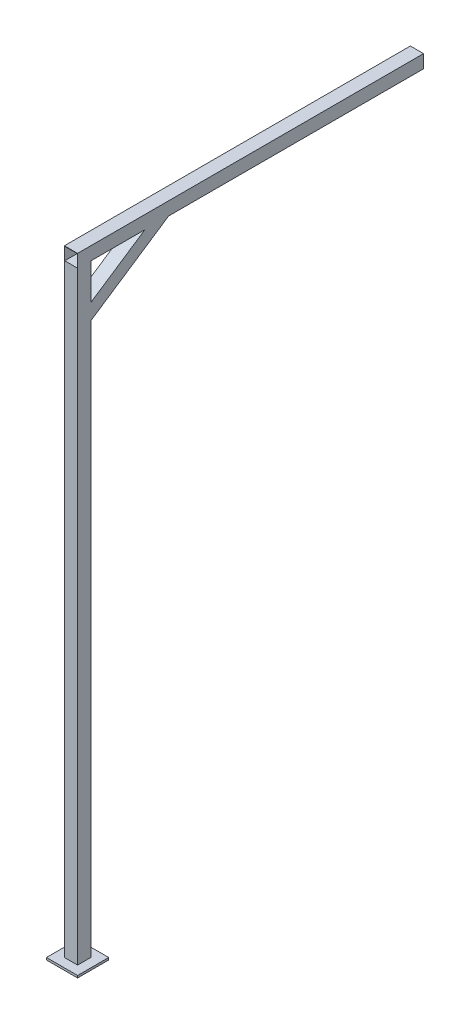
ISO-10303-21;
HEADER;
FILE_DESCRIPTION(('STEP AP214'),'2;1');
FILE_NAME('part.step','',(''),(''),'','','');
FILE_SCHEMA(('AUTOMOTIVE_DESIGN { 1 0 10303 214 1 1 1 1 }'));
ENDSEC;
DATA;
#1=APPLICATION_CONTEXT('core data for automotive mechanical design processes');
#2=APPLICATION_PROTOCOL_DEFINITION('international standard','automotive_design',2000,#1);
#3=PRODUCT_CONTEXT('',#1,'mechanical');
#4=PRODUCT('Part','Part','',(#3));
#5=PRODUCT_RELATED_PRODUCT_CATEGORY('part','',(#4));
#6=PRODUCT_DEFINITION_FORMATION('','',#4);
#7=PRODUCT_DEFINITION_CONTEXT('part definition',#1,'design');
#8=PRODUCT_DEFINITION('design','',#6,#7);
#9=PRODUCT_DEFINITION_SHAPE('','',#8);
#10=(LENGTH_UNIT() NAMED_UNIT(*) SI_UNIT(.MILLI.,.METRE.));
#11=(NAMED_UNIT(*) PLANE_ANGLE_UNIT() SI_UNIT($,.RADIAN.));
#12=(NAMED_UNIT(*) SI_UNIT($,.STERADIAN.) SOLID_ANGLE_UNIT());
#13=UNCERTAINTY_MEASURE_WITH_UNIT(LENGTH_MEASURE(1.E-05),#10,'distance_accuracy_value','');
#14=(GEOMETRIC_REPRESENTATION_CONTEXT(3) GLOBAL_UNCERTAINTY_ASSIGNED_CONTEXT((#13)) GLOBAL_UNIT_ASSIGNED_CONTEXT((#10,
#11,#12)) REPRESENTATION_CONTEXT('',''));
#15=CARTESIAN_POINT('',(0.,0.,0.));
#16=DIRECTION('',(0.,0.,1.));
#17=DIRECTION('',(1.,0.,0.));
#18=AXIS2_PLACEMENT_3D('',#15,#16,#17);
#19=CARTESIAN_POINT('',(0.,-76.2,2000.));
#20=DIRECTION('',(0.,1.,0.));
#21=DIRECTION('',(0.,0.,1.));
#22=AXIS2_PLACEMENT_3D('',#19,#20,#21);
#23=PLANE('',#22);
#24=DIRECTION('',(0.,0.,-1.));
#25=VECTOR('',#24,1.);
#26=CARTESIAN_POINT('',(76.2,-76.2,2000.));
#27=LINE('',#26,#25);
#28=CARTESIAN_POINT('',(76.2,-76.2,1473.8));
#29=VERTEX_POINT('',#28);
#30=CARTESIAN_POINT('',(76.2,-76.2,0.));
#31=VERTEX_POINT('',#30);
#32=EDGE_CURVE('E209',#29,#31,#27,.T.);
#33=ORIENTED_EDGE('',*,*,#32,.F.);
#34=DIRECTION('',(1.,0.,0.));
#35=VECTOR('',#34,1.);
#36=CARTESIAN_POINT('',(-540.832691319598,-76.2000000000001,1473.8));
#37=LINE('',#36,#35);
#38=CARTESIAN_POINT('',(0.,-76.2000000000001,1473.8));
#39=VERTEX_POINT('',#38);
#40=EDGE_CURVE('E349',#39,#29,#37,.T.);
#41=ORIENTED_EDGE('',*,*,#40,.F.);
#42=DIRECTION('',(0.,0.,-1.));
#43=VECTOR('',#42,1.);
#44=CARTESIAN_POINT('',(0.,-76.2,2000.));
#45=LINE('',#44,#43);
#46=CARTESIAN_POINT('',(0.,-76.2,0.));
#47=VERTEX_POINT('',#46);
#48=EDGE_CURVE('E208',#39,#47,#45,.T.);
#49=ORIENTED_EDGE('',*,*,#48,.T.);
#50=DIRECTION('',(1.,0.,0.));
#51=VECTOR('',#50,1.);
#52=CARTESIAN_POINT('',(0.,-76.2,0.));
#53=LINE('',#52,#51);
#54=EDGE_CURVE('E224',#47,#31,#53,.T.);
#55=ORIENTED_EDGE('',*,*,#54,.T.);
#56=EDGE_LOOP('',(#33,#41,#49,#55));
#57=FACE_BOUND('',#56,.T.);
#58=ADVANCED_FACE('F34',(#57),#23,.F.);
#59=CARTESIAN_POINT('',(76.2,-3576.2,1923.8));
#60=DIRECTION('',(0.,0.,1.));
#61=DIRECTION('',(1.,0.,0.));
#62=AXIS2_PLACEMENT_3D('',#59,#60,#61);
#63=PLANE('',#62);
#64=DIRECTION('',(0.,1.,0.));
#65=VECTOR('',#64,1.);
#66=CARTESIAN_POINT('',(0.,-3576.2,1923.8));
#67=LINE('',#66,#65);
#68=CARTESIAN_POINT('',(0.,-3563.5,1923.8));
#69=VERTEX_POINT('',#68);
#70=CARTESIAN_POINT('',(0.,-376.2,1923.8));
#71=VERTEX_POINT('',#70);
#72=EDGE_CURVE('E58',#69,#71,#67,.T.);
#73=ORIENTED_EDGE('',*,*,#72,.T.);
#74=DIRECTION('',(1.,0.,0.));
#75=VECTOR('',#74,1.);
#76=CARTESIAN_POINT('',(-540.832691319598,-376.2,1923.8));
#77=LINE('',#76,#75);
#78=CARTESIAN_POINT('',(76.2,-376.2,1923.8));
#79=VERTEX_POINT('',#78);
#80=EDGE_CURVE('E347',#71,#79,#77,.T.);
#81=ORIENTED_EDGE('',*,*,#80,.T.);
#82=DIRECTION('',(0.,1.,0.));
#83=VECTOR('',#82,1.);
#84=CARTESIAN_POINT('',(76.2,-3576.2,1923.8));
#85=LINE('',#84,#83);
#86=CARTESIAN_POINT('',(76.2,-3563.5,1923.8));
#87=VERTEX_POINT('',#86);
#88=EDGE_CURVE('E268',#87,#79,#85,.T.);
#89=ORIENTED_EDGE('',*,*,#88,.F.);
#90=DIRECTION('',(-1.,0.,0.));
#91=VECTOR('',#90,1.);
#92=CARTESIAN_POINT('',(76.2,-3563.5,1923.8));
#93=LINE('',#92,#91);
#94=EDGE_CURVE('E300',#87,#69,#93,.T.);
#95=ORIENTED_EDGE('',*,*,#94,.T.);
#96=EDGE_LOOP('',(#73,#81,#89,#95));
#97=FACE_BOUND('',#96,.T.);
#98=ADVANCED_FACE('F360',(#97),#63,.F.);
#99=CARTESIAN_POINT('',(0.,-76.2,1923.8));
#100=VERTEX_POINT('',#99);
#101=CARTESIAN_POINT('',(0.,-76.2000000000001,1611.17150359518));
#102=VERTEX_POINT('',#101);
#103=EDGE_CURVE('E43',#100,#102,#45,.T.);
#104=ORIENTED_EDGE('',*,*,#103,.T.);
#105=DIRECTION('',(1.,0.,0.));
#106=VECTOR('',#105,1.);
#107=CARTESIAN_POINT('',(-540.832691319598,-76.2000000000001,1611.17150359518));
#108=LINE('',#107,#106);
#109=CARTESIAN_POINT('',(76.2,-76.2,1611.17150359518));
#110=VERTEX_POINT('',#109);
#111=EDGE_CURVE('E191',#102,#110,#108,.T.);
#112=ORIENTED_EDGE('',*,*,#111,.T.);
#113=CARTESIAN_POINT('',(76.2,-76.2,1923.8));
#114=VERTEX_POINT('',#113);
#115=EDGE_CURVE('E202',#114,#110,#27,.T.);
#116=ORIENTED_EDGE('',*,*,#115,.F.);
#117=DIRECTION('',(1.,0.,0.));
#118=VECTOR('',#117,1.);
#119=CARTESIAN_POINT('',(76.2,-76.2,1923.8));
#120=LINE('',#119,#118);
#121=EDGE_CURVE('E270',#100,#114,#120,.T.);
#122=ORIENTED_EDGE('',*,*,#121,.F.);
#123=EDGE_LOOP('',(#104,#112,#116,#122));
#124=FACE_BOUND('',#123,.T.);
#125=ADVANCED_FACE('F200',(#124),#23,.F.);
#126=CARTESIAN_POINT('',(0.,0.,2000.));
#127=DIRECTION('',(0.,0.,1.));
#128=DIRECTION('',(1.,0.,0.));
#129=AXIS2_PLACEMENT_3D('',#126,#127,#128);
#130=PLANE('',#129);
#131=DIRECTION('',(-1.,0.,0.));
#132=VECTOR('',#131,1.);
#133=CARTESIAN_POINT('',(0.,-3563.5,2000.));
#134=LINE('',#133,#132);
#135=CARTESIAN_POINT('',(76.2000000000007,-3563.5,2000.));
#136=VERTEX_POINT('',#135);
#137=CARTESIAN_POINT('',(4.36402886876159E-13,-3563.5,2000.));
#138=VERTEX_POINT('',#137);
#139=EDGE_CURVE('E292',#136,#138,#134,.T.);
#140=ORIENTED_EDGE('',*,*,#139,.F.);
#141=DIRECTION('',(0.,1.,0.));
#142=VECTOR('',#141,1.);
#143=CARTESIAN_POINT('',(76.2,0.,2000.));
#144=LINE('',#143,#142);
#145=CARTESIAN_POINT('',(76.2,0.,2000.));
#146=VERTEX_POINT('',#145);
#147=EDGE_CURVE('E232',#136,#146,#144,.T.);
#148=ORIENTED_EDGE('',*,*,#147,.T.);
#149=DIRECTION('',(-1.,0.,0.));
#150=VECTOR('',#149,1.);
#151=CARTESIAN_POINT('',(0.,0.,2000.));
#152=LINE('',#151,#150);
#153=CARTESIAN_POINT('',(0.,0.,2000.));
#154=VERTEX_POINT('',#153);
#155=EDGE_CURVE('E218',#146,#154,#152,.T.);
#156=ORIENTED_EDGE('',*,*,#155,.T.);
#157=DIRECTION('',(0.,-1.,0.));
#158=VECTOR('',#157,1.);
#159=CARTESIAN_POINT('',(0.,0.,2000.));
#160=LINE('',#159,#158);
#161=EDGE_CURVE('E221',#154,#138,#160,.T.);
#162=ORIENTED_EDGE('',*,*,#161,.T.);
#163=EDGE_LOOP('',(#140,#148,#156,#162));
#164=FACE_BOUND('',#163,.T.);
#165=DIRECTION('',(-1.,0.,0.));
#166=VECTOR('',#165,1.);
#167=CARTESIAN_POINT('',(1.9,-1.9,2000.));
#168=LINE('',#167,#166);
#169=CARTESIAN_POINT('',(74.3,-1.9,2000.));
#170=VERTEX_POINT('',#169);
#171=CARTESIAN_POINT('',(1.9,-1.9,2000.));
#172=VERTEX_POINT('',#171);
#173=EDGE_CURVE('E263',#170,#172,#168,.T.);
#174=ORIENTED_EDGE('',*,*,#173,.F.);
#175=DIRECTION('',(0.,1.,0.));
#176=VECTOR('',#175,1.);
#177=CARTESIAN_POINT('',(74.3,-74.3,2000.));
#178=LINE('',#177,#176);
#179=CARTESIAN_POINT('',(74.3,-74.3,2000.));
#180=VERTEX_POINT('',#179);
#181=EDGE_CURVE('E249',#180,#170,#178,.T.);
#182=ORIENTED_EDGE('',*,*,#181,.F.);
#183=DIRECTION('',(1.,0.,0.));
#184=VECTOR('',#183,1.);
#185=CARTESIAN_POINT('',(1.9,-74.3,2000.));
#186=LINE('',#185,#184);
#187=CARTESIAN_POINT('',(1.9,-74.3,2000.));
#188=VERTEX_POINT('',#187);
#189=EDGE_CURVE('E245',#188,#180,#186,.T.);
#190=ORIENTED_EDGE('',*,*,#189,.F.);
#191=DIRECTION('',(0.,-1.,0.));
#192=VECTOR('',#191,1.);
#193=CARTESIAN_POINT('',(1.9,-74.3,2000.));
#194=LINE('',#193,#192);
#195=EDGE_CURVE('E260',#172,#188,#194,.T.);
#196=ORIENTED_EDGE('',*,*,#195,.F.);
#197=EDGE_LOOP('',(#174,#182,#190,#196));
#198=FACE_BOUND('',#197,.T.);
#199=ADVANCED_FACE('F368',(#164,#198),#130,.T.);
#200=CARTESIAN_POINT('',(0.,0.,0.));
#201=DIRECTION('',(0.,0.,1.));
#202=DIRECTION('',(1.,0.,0.));
#203=AXIS2_PLACEMENT_3D('',#200,#201,#202);
#204=PLANE('',#203);
#205=DIRECTION('',(0.,-1.,0.));
#206=VECTOR('',#205,1.);
#207=CARTESIAN_POINT('',(0.,0.,0.));
#208=LINE('',#207,#206);
#209=CARTESIAN_POINT('',(0.,0.,0.));
#210=VERTEX_POINT('',#209);
#211=EDGE_CURVE('E227',#210,#47,#208,.T.);
#212=ORIENTED_EDGE('',*,*,#211,.F.);
#213=DIRECTION('',(-1.,0.,0.));
#214=VECTOR('',#213,1.);
#215=CARTESIAN_POINT('',(0.,0.,0.));
#216=LINE('',#215,#214);
#217=CARTESIAN_POINT('',(76.2,0.,0.));
#218=VERTEX_POINT('',#217);
#219=EDGE_CURVE('E219',#218,#210,#216,.T.);
#220=ORIENTED_EDGE('',*,*,#219,.F.);
#221=DIRECTION('',(0.,1.,0.));
#222=VECTOR('',#221,1.);
#223=CARTESIAN_POINT('',(76.2,0.,0.));
#224=LINE('',#223,#222);
#225=EDGE_CURVE('E222',#31,#218,#224,.T.);
#226=ORIENTED_EDGE('',*,*,#225,.F.);
#227=ORIENTED_EDGE('',*,*,#54,.F.);
#228=EDGE_LOOP('',(#212,#220,#226,#227));
#229=FACE_BOUND('',#228,.T.);
#230=DIRECTION('',(0.,1.,0.));
#231=VECTOR('',#230,1.);
#232=CARTESIAN_POINT('',(74.3,-74.3,0.));
#233=LINE('',#232,#231);
#234=CARTESIAN_POINT('',(74.3,-74.3,0.));
#235=VERTEX_POINT('',#234);
#236=CARTESIAN_POINT('',(74.3,-1.9,0.));
#237=VERTEX_POINT('',#236);
#238=EDGE_CURVE('E256',#235,#237,#233,.T.);
#239=ORIENTED_EDGE('',*,*,#238,.T.);
#240=DIRECTION('',(-1.,0.,0.));
#241=VECTOR('',#240,1.);
#242=CARTESIAN_POINT('',(1.9,-1.9,0.));
#243=LINE('',#242,#241);
#244=CARTESIAN_POINT('',(1.9,-1.9,0.));
#245=VERTEX_POINT('',#244);
#246=EDGE_CURVE('E253',#237,#245,#243,.T.);
#247=ORIENTED_EDGE('',*,*,#246,.T.);
#248=DIRECTION('',(0.,-1.,0.));
#249=VECTOR('',#248,1.);
#250=CARTESIAN_POINT('',(1.9,-74.3,0.));
#251=LINE('',#250,#249);
#252=CARTESIAN_POINT('',(1.9,-74.3,0.));
#253=VERTEX_POINT('',#252);
#254=EDGE_CURVE('E250',#245,#253,#251,.T.);
#255=ORIENTED_EDGE('',*,*,#254,.T.);
#256=DIRECTION('',(1.,0.,0.));
#257=VECTOR('',#256,1.);
#258=CARTESIAN_POINT('',(1.9,-74.3,0.));
#259=LINE('',#258,#257);
#260=EDGE_CURVE('E246',#253,#235,#259,.T.);
#261=ORIENTED_EDGE('',*,*,#260,.T.);
#262=EDGE_LOOP('',(#239,#247,#255,#261));
#263=FACE_BOUND('',#262,.T.);
#264=ADVANCED_FACE('F378',(#229,#263),#204,.F.);
#265=CARTESIAN_POINT('',(0.,0.,2000.));
#266=DIRECTION('',(1.,0.,0.));
#267=DIRECTION('',(0.,1.,0.));
#268=AXIS2_PLACEMENT_3D('',#265,#266,#267);
#269=PLANE('',#268);
#270=ORIENTED_EDGE('',*,*,#48,.F.);
#271=DIRECTION('',(0.,-0.554700196225229,0.832050294337844));
#272=VECTOR('',#271,1.);
#273=CARTESIAN_POINT('',(0.,-76.2000000000001,1473.8));
#274=LINE('',#273,#272);
#275=EDGE_CURVE('E344',#39,#71,#274,.T.);
#276=ORIENTED_EDGE('',*,*,#275,.T.);
#277=ORIENTED_EDGE('',*,*,#72,.F.);
#278=DIRECTION('',(0.,0.,1.));
#279=VECTOR('',#278,1.);
#280=CARTESIAN_POINT('',(4.36402886876159E-13,-3563.5,2000.));
#281=LINE('',#280,#279);
#282=EDGE_CURVE('E294',#69,#138,#281,.T.);
#283=ORIENTED_EDGE('',*,*,#282,.T.);
#284=ORIENTED_EDGE('',*,*,#161,.F.);
#285=DIRECTION('',(0.,0.,-1.));
#286=VECTOR('',#285,1.);
#287=CARTESIAN_POINT('',(0.,0.,2000.));
#288=LINE('',#287,#286);
#289=EDGE_CURVE('E215',#154,#210,#288,.T.);
#290=ORIENTED_EDGE('',*,*,#289,.T.);
#291=ORIENTED_EDGE('',*,*,#211,.T.);
#292=EDGE_LOOP('',(#270,#276,#277,#283,#284,#290,#291));
#293=FACE_BOUND('',#292,.T.);
#294=DIRECTION('',(0.,0.554700196225229,-0.832050294337844));
#295=VECTOR('',#294,1.);
#296=CARTESIAN_POINT('',(0.,-76.2,1611.17150359518));
#297=LINE('',#296,#295);
#298=CARTESIAN_POINT('',(0.,-284.618997603215,1923.8));
#299=VERTEX_POINT('',#298);
#300=EDGE_CURVE('E333',#299,#102,#297,.T.);
#301=ORIENTED_EDGE('',*,*,#300,.T.);
#302=ORIENTED_EDGE('',*,*,#103,.F.);
#303=EDGE_CURVE('E267',#299,#100,#67,.T.);
#304=ORIENTED_EDGE('',*,*,#303,.F.);
#305=EDGE_LOOP('',(#301,#302,#304));
#306=FACE_BOUND('',#305,.T.);
#307=ADVANCED_FACE('F36',(#293,#306),#269,.F.);
#308=CARTESIAN_POINT('',(76.2,0.,2000.));
#309=DIRECTION('',(-1.,0.,0.));
#310=DIRECTION('',(0.,-1.,0.));
#311=AXIS2_PLACEMENT_3D('',#308,#309,#310);
#312=PLANE('',#311);
#313=ORIENTED_EDGE('',*,*,#115,.T.);
#314=DIRECTION('',(0.,-0.554700196225229,0.832050294337844));
#315=VECTOR('',#314,1.);
#316=CARTESIAN_POINT('',(76.2,-76.2,1611.17150359518));
#317=LINE('',#316,#315);
#318=CARTESIAN_POINT('',(76.2,-284.618997603215,1923.8));
#319=VERTEX_POINT('',#318);
#320=EDGE_CURVE('E187',#110,#319,#317,.T.);
#321=ORIENTED_EDGE('',*,*,#320,.T.);
#322=EDGE_CURVE('E207',#319,#114,#85,.T.);
#323=ORIENTED_EDGE('',*,*,#322,.T.);
#324=EDGE_LOOP('',(#313,#321,#323));
#325=FACE_BOUND('',#324,.T.);
#326=ORIENTED_EDGE('',*,*,#147,.F.);
#327=DIRECTION('',(0.,0.,-1.));
#328=VECTOR('',#327,1.);
#329=CARTESIAN_POINT('',(76.2000000000007,-3563.5,2000.));
#330=LINE('',#329,#328);
#331=EDGE_CURVE('E297',#136,#87,#330,.T.);
#332=ORIENTED_EDGE('',*,*,#331,.T.);
#333=ORIENTED_EDGE('',*,*,#88,.T.);
#334=DIRECTION('',(0.,0.554700196225229,-0.832050294337844));
#335=VECTOR('',#334,1.);
#336=CARTESIAN_POINT('',(76.2,-76.2,1473.8));
#337=LINE('',#336,#335);
#338=EDGE_CURVE('E50',#79,#29,#337,.T.);
#339=ORIENTED_EDGE('',*,*,#338,.T.);
#340=ORIENTED_EDGE('',*,*,#32,.T.);
#341=ORIENTED_EDGE('',*,*,#225,.T.);
#342=DIRECTION('',(0.,0.,-1.));
#343=VECTOR('',#342,1.);
#344=CARTESIAN_POINT('',(76.2,0.,2000.));
#345=LINE('',#344,#343);
#346=EDGE_CURVE('E211',#146,#218,#345,.T.);
#347=ORIENTED_EDGE('',*,*,#346,.F.);
#348=EDGE_LOOP('',(#326,#332,#333,#339,#340,#341,#347));
#349=FACE_BOUND('',#348,.T.);
#350=ADVANCED_FACE('F206',(#325,#349),#312,.F.);
#351=CARTESIAN_POINT('',(0.,0.,2000.));
#352=DIRECTION('',(0.,-1.,0.));
#353=DIRECTION('',(0.,0.,-1.));
#354=AXIS2_PLACEMENT_3D('',#351,#352,#353);
#355=PLANE('',#354);
#356=ORIENTED_EDGE('',*,*,#219,.T.);
#357=ORIENTED_EDGE('',*,*,#289,.F.);
#358=ORIENTED_EDGE('',*,*,#155,.F.);
#359=ORIENTED_EDGE('',*,*,#346,.T.);
#360=EDGE_LOOP('',(#356,#357,#358,#359));
#361=FACE_BOUND('',#360,.T.);
#362=ADVANCED_FACE('F383',(#361),#355,.F.);
#363=CARTESIAN_POINT('',(74.3,-74.3,2000.));
#364=DIRECTION('',(-1.,0.,0.));
#365=DIRECTION('',(0.,0.,1.));
#366=AXIS2_PLACEMENT_3D('',#363,#364,#365);
#367=PLANE('',#366);
#368=ORIENTED_EDGE('',*,*,#238,.F.);
#369=DIRECTION('',(0.,0.,-1.));
#370=VECTOR('',#369,1.);
#371=CARTESIAN_POINT('',(74.3,-74.3,2000.));
#372=LINE('',#371,#370);
#373=EDGE_CURVE('E242',#180,#235,#372,.T.);
#374=ORIENTED_EDGE('',*,*,#373,.F.);
#375=ORIENTED_EDGE('',*,*,#181,.T.);
#376=DIRECTION('',(0.,0.,-1.));
#377=VECTOR('',#376,1.);
#378=CARTESIAN_POINT('',(74.3,-1.9,2000.));
#379=LINE('',#378,#377);
#380=EDGE_CURVE('E230',#170,#237,#379,.T.);
#381=ORIENTED_EDGE('',*,*,#380,.T.);
#382=EDGE_LOOP('',(#368,#374,#375,#381));
#383=FACE_BOUND('',#382,.T.);
#384=ADVANCED_FACE('F385',(#383),#367,.T.);
#385=CARTESIAN_POINT('',(1.9,-1.9,2000.));
#386=DIRECTION('',(0.,-1.,0.));
#387=DIRECTION('',(0.,0.,-1.));
#388=AXIS2_PLACEMENT_3D('',#385,#386,#387);
#389=PLANE('',#388);
#390=ORIENTED_EDGE('',*,*,#246,.F.);
#391=ORIENTED_EDGE('',*,*,#380,.F.);
#392=ORIENTED_EDGE('',*,*,#173,.T.);
#393=DIRECTION('',(0.,0.,-1.));
#394=VECTOR('',#393,1.);
#395=CARTESIAN_POINT('',(1.9,-1.9,2000.));
#396=LINE('',#395,#394);
#397=EDGE_CURVE('E238',#172,#245,#396,.T.);
#398=ORIENTED_EDGE('',*,*,#397,.T.);
#399=EDGE_LOOP('',(#390,#391,#392,#398));
#400=FACE_BOUND('',#399,.T.);
#401=ADVANCED_FACE('F391',(#400),#389,.T.);
#402=CARTESIAN_POINT('',(1.9,-74.3,2000.));
#403=DIRECTION('',(1.,0.,0.));
#404=DIRECTION('',(0.,0.,-1.));
#405=AXIS2_PLACEMENT_3D('',#402,#403,#404);
#406=PLANE('',#405);
#407=ORIENTED_EDGE('',*,*,#254,.F.);
#408=ORIENTED_EDGE('',*,*,#397,.F.);
#409=ORIENTED_EDGE('',*,*,#195,.T.);
#410=DIRECTION('',(0.,0.,-1.));
#411=VECTOR('',#410,1.);
#412=CARTESIAN_POINT('',(1.9,-74.3,2000.));
#413=LINE('',#412,#411);
#414=EDGE_CURVE('E240',#188,#253,#413,.T.);
#415=ORIENTED_EDGE('',*,*,#414,.T.);
#416=EDGE_LOOP('',(#407,#408,#409,#415));
#417=FACE_BOUND('',#416,.T.);
#418=ADVANCED_FACE('F450',(#417),#406,.T.);
#419=CARTESIAN_POINT('',(1.9,-74.3,2000.));
#420=DIRECTION('',(0.,1.,0.));
#421=DIRECTION('',(0.,0.,1.));
#422=AXIS2_PLACEMENT_3D('',#419,#420,#421);
#423=PLANE('',#422);
#424=ORIENTED_EDGE('',*,*,#260,.F.);
#425=ORIENTED_EDGE('',*,*,#414,.F.);
#426=ORIENTED_EDGE('',*,*,#189,.T.);
#427=ORIENTED_EDGE('',*,*,#373,.T.);
#428=EDGE_LOOP('',(#424,#425,#426,#427));
#429=FACE_BOUND('',#428,.T.);
#430=ADVANCED_FACE('F446',(#429),#423,.T.);
#431=ORIENTED_EDGE('',*,*,#322,.F.);
#432=DIRECTION('',(1.,0.,0.));
#433=VECTOR('',#432,1.);
#434=CARTESIAN_POINT('',(-540.832691319598,-284.618997603215,1923.8));
#435=LINE('',#434,#433);
#436=EDGE_CURVE('E194',#299,#319,#435,.T.);
#437=ORIENTED_EDGE('',*,*,#436,.F.);
#438=ORIENTED_EDGE('',*,*,#303,.T.);
#439=ORIENTED_EDGE('',*,*,#121,.T.);
#440=EDGE_LOOP('',(#431,#437,#438,#439));
#441=FACE_BOUND('',#440,.T.);
#442=ADVANCED_FACE('F402',(#441),#63,.F.);
#443=CARTESIAN_POINT('',(0.,-3563.5,0.));
#444=DIRECTION('',(0.,1.,0.));
#445=DIRECTION('',(0.,0.,1.));
#446=AXIS2_PLACEMENT_3D('',#443,#444,#445);
#447=PLANE('',#446);
#448=ORIENTED_EDGE('',*,*,#331,.F.);
#449=ORIENTED_EDGE('',*,*,#139,.T.);
#450=ORIENTED_EDGE('',*,*,#282,.F.);
#451=ORIENTED_EDGE('',*,*,#94,.F.);
#452=EDGE_LOOP('',(#448,#449,#450,#451));
#453=FACE_BOUND('',#452,.T.);
#454=DIRECTION('',(0.,0.,1.));
#455=VECTOR('',#454,1.);
#456=CARTESIAN_POINT('',(128.1,-3563.5,1871.9));
#457=LINE('',#456,#455);
#458=CARTESIAN_POINT('',(128.1,-3563.5,1871.9));
#459=VERTEX_POINT('',#458);
#460=CARTESIAN_POINT('',(128.1,-3563.5,2051.9));
#461=VERTEX_POINT('',#460);
#462=EDGE_CURVE('E323',#459,#461,#457,.T.);
#463=ORIENTED_EDGE('',*,*,#462,.F.);
#464=DIRECTION('',(1.,0.,0.));
#465=VECTOR('',#464,1.);
#466=CARTESIAN_POINT('',(-51.8999999999998,-3563.5,1871.9));
#467=LINE('',#466,#465);
#468=CARTESIAN_POINT('',(-51.8999999999998,-3563.5,1871.9));
#469=VERTEX_POINT('',#468);
#470=EDGE_CURVE('E315',#469,#459,#467,.T.);
#471=ORIENTED_EDGE('',*,*,#470,.F.);
#472=DIRECTION('',(0.,0.,-1.));
#473=VECTOR('',#472,1.);
#474=CARTESIAN_POINT('',(-51.8999999999998,-3563.5,1871.9));
#475=LINE('',#474,#473);
#476=CARTESIAN_POINT('',(-51.8999999999998,-3563.5,2051.9));
#477=VERTEX_POINT('',#476);
#478=EDGE_CURVE('E336',#477,#469,#475,.T.);
#479=ORIENTED_EDGE('',*,*,#478,.F.);
#480=DIRECTION('',(-1.,0.,0.));
#481=VECTOR('',#480,1.);
#482=CARTESIAN_POINT('',(-51.8999999999998,-3563.5,2051.9));
#483=LINE('',#482,#481);
#484=EDGE_CURVE('E339',#461,#477,#483,.T.);
#485=ORIENTED_EDGE('',*,*,#484,.F.);
#486=EDGE_LOOP('',(#463,#471,#479,#485));
#487=FACE_BOUND('',#486,.T.);
#488=ADVANCED_FACE('F365',(#453,#487),#447,.T.);
#489=CARTESIAN_POINT('',(128.1,-3563.5,1871.9));
#490=DIRECTION('',(1.,0.,0.));
#491=DIRECTION('',(0.,0.,-1.));
#492=AXIS2_PLACEMENT_3D('',#489,#490,#491);
#493=PLANE('',#492);
#494=DIRECTION('',(0.,0.,1.));
#495=VECTOR('',#494,1.);
#496=CARTESIAN_POINT('',(128.1,-3576.2,1871.9));
#497=LINE('',#496,#495);
#498=CARTESIAN_POINT('',(128.1,-3576.2,1871.9));
#499=VERTEX_POINT('',#498);
#500=CARTESIAN_POINT('',(128.1,-3576.2,2051.9));
#501=VERTEX_POINT('',#500);
#502=EDGE_CURVE('E330',#499,#501,#497,.T.);
#503=ORIENTED_EDGE('',*,*,#502,.F.);
#504=DIRECTION('',(0.,-1.,0.));
#505=VECTOR('',#504,1.);
#506=CARTESIAN_POINT('',(128.1,-3563.5,1871.9));
#507=LINE('',#506,#505);
#508=EDGE_CURVE('E311',#459,#499,#507,.T.);
#509=ORIENTED_EDGE('',*,*,#508,.F.);
#510=ORIENTED_EDGE('',*,*,#462,.T.);
#511=DIRECTION('',(0.,-1.,0.));
#512=VECTOR('',#511,1.);
#513=CARTESIAN_POINT('',(128.1,-3563.5,2051.9));
#514=LINE('',#513,#512);
#515=EDGE_CURVE('E312',#461,#501,#514,.T.);
#516=ORIENTED_EDGE('',*,*,#515,.T.);
#517=EDGE_LOOP('',(#503,#509,#510,#516));
#518=FACE_BOUND('',#517,.T.);
#519=ADVANCED_FACE('F562',(#518),#493,.T.);
#520=CARTESIAN_POINT('',(-51.8999999999998,-3563.5,1871.9));
#521=DIRECTION('',(0.,0.,-1.));
#522=DIRECTION('',(-1.,0.,0.));
#523=AXIS2_PLACEMENT_3D('',#520,#521,#522);
#524=PLANE('',#523);
#525=DIRECTION('',(1.,0.,0.));
#526=VECTOR('',#525,1.);
#527=CARTESIAN_POINT('',(-51.8999999999998,-3576.2,1871.9));
#528=LINE('',#527,#526);
#529=CARTESIAN_POINT('',(-51.8999999999998,-3576.2,1871.9));
#530=VERTEX_POINT('',#529);
#531=EDGE_CURVE('E320',#530,#499,#528,.T.);
#532=ORIENTED_EDGE('',*,*,#531,.F.);
#533=DIRECTION('',(0.,-1.,0.));
#534=VECTOR('',#533,1.);
#535=CARTESIAN_POINT('',(-51.8999999999998,-3563.5,1871.9));
#536=LINE('',#535,#534);
#537=EDGE_CURVE('E317',#469,#530,#536,.T.);
#538=ORIENTED_EDGE('',*,*,#537,.F.);
#539=ORIENTED_EDGE('',*,*,#470,.T.);
#540=ORIENTED_EDGE('',*,*,#508,.T.);
#541=EDGE_LOOP('',(#532,#538,#539,#540));
#542=FACE_BOUND('',#541,.T.);
#543=ADVANCED_FACE('F570',(#542),#524,.T.);
#544=CARTESIAN_POINT('',(-51.8999999999998,-3563.5,1871.9));
#545=DIRECTION('',(-1.,0.,0.));
#546=DIRECTION('',(0.,0.,1.));
#547=AXIS2_PLACEMENT_3D('',#544,#545,#546);
#548=PLANE('',#547);
#549=DIRECTION('',(0.,0.,-1.));
#550=VECTOR('',#549,1.);
#551=CARTESIAN_POINT('',(-51.8999999999998,-3576.2,1871.9));
#552=LINE('',#551,#550);
#553=CARTESIAN_POINT('',(-51.8999999999998,-3576.2,2051.9));
#554=VERTEX_POINT('',#553);
#555=EDGE_CURVE('E324',#554,#530,#552,.T.);
#556=ORIENTED_EDGE('',*,*,#555,.F.);
#557=DIRECTION('',(0.,-1.,0.));
#558=VECTOR('',#557,1.);
#559=CARTESIAN_POINT('',(-51.8999999999998,-3563.5,2051.9));
#560=LINE('',#559,#558);
#561=EDGE_CURVE('E314',#477,#554,#560,.T.);
#562=ORIENTED_EDGE('',*,*,#561,.F.);
#563=ORIENTED_EDGE('',*,*,#478,.T.);
#564=ORIENTED_EDGE('',*,*,#537,.T.);
#565=EDGE_LOOP('',(#556,#562,#563,#564));
#566=FACE_BOUND('',#565,.T.);
#567=ADVANCED_FACE('F580',(#566),#548,.T.);
#568=CARTESIAN_POINT('',(-51.8999999999998,-3563.5,2051.9));
#569=DIRECTION('',(0.,0.,1.));
#570=DIRECTION('',(1.,0.,0.));
#571=AXIS2_PLACEMENT_3D('',#568,#569,#570);
#572=PLANE('',#571);
#573=DIRECTION('',(-1.,0.,0.));
#574=VECTOR('',#573,1.);
#575=CARTESIAN_POINT('',(-51.8999999999998,-3576.2,2051.9));
#576=LINE('',#575,#574);
#577=EDGE_CURVE('E327',#501,#554,#576,.T.);
#578=ORIENTED_EDGE('',*,*,#577,.F.);
#579=ORIENTED_EDGE('',*,*,#515,.F.);
#580=ORIENTED_EDGE('',*,*,#484,.T.);
#581=ORIENTED_EDGE('',*,*,#561,.T.);
#582=EDGE_LOOP('',(#578,#579,#580,#581));
#583=FACE_BOUND('',#582,.T.);
#584=ADVANCED_FACE('F442',(#583),#572,.T.);
#585=CARTESIAN_POINT('',(0.,-3576.2,0.));
#586=DIRECTION('',(0.,1.,0.));
#587=DIRECTION('',(0.,0.,1.));
#588=AXIS2_PLACEMENT_3D('',#585,#586,#587);
#589=PLANE('',#588);
#590=ORIENTED_EDGE('',*,*,#502,.T.);
#591=ORIENTED_EDGE('',*,*,#577,.T.);
#592=ORIENTED_EDGE('',*,*,#555,.T.);
#593=ORIENTED_EDGE('',*,*,#531,.T.);
#594=EDGE_LOOP('',(#590,#591,#592,#593));
#595=FACE_BOUND('',#594,.T.);
#596=ADVANCED_FACE('F440',(#595),#589,.F.);
#597=CARTESIAN_POINT('',(-540.832691319598,-76.2000000000001,1473.8));
#598=DIRECTION('',(0.,-0.832050294337844,-0.554700196225229));
#599=DIRECTION('',(0.,0.554700196225229,-0.832050294337844));
#600=AXIS2_PLACEMENT_3D('',#597,#598,#599);
#601=PLANE('',#600);
#602=ORIENTED_EDGE('',*,*,#275,.F.);
#603=ORIENTED_EDGE('',*,*,#40,.T.);
#604=ORIENTED_EDGE('',*,*,#338,.F.);
#605=ORIENTED_EDGE('',*,*,#80,.F.);
#606=EDGE_LOOP('',(#602,#603,#604,#605));
#607=FACE_BOUND('',#606,.T.);
#608=ADVANCED_FACE('F358',(#607),#601,.T.);
#609=CARTESIAN_POINT('',(-540.832691319598,-76.2000000000001,1611.17150359518));
#610=DIRECTION('',(0.,0.832050294337844,0.554700196225229));
#611=DIRECTION('',(0.,-0.554700196225229,0.832050294337844));
#612=AXIS2_PLACEMENT_3D('',#609,#610,#611);
#613=PLANE('',#612);
#614=ORIENTED_EDGE('',*,*,#300,.F.);
#615=ORIENTED_EDGE('',*,*,#436,.T.);
#616=ORIENTED_EDGE('',*,*,#320,.F.);
#617=ORIENTED_EDGE('',*,*,#111,.F.);
#618=EDGE_LOOP('',(#614,#615,#616,#617));
#619=FACE_BOUND('',#618,.T.);
#620=ADVANCED_FACE('F190',(#619),#613,.T.);
#621=CLOSED_SHELL('',(#58,#98,#125,#199,#264,#307,#350,#362,#384,#401,#418,#430,#442,#488,#519,
#543,#567,#584,#596,#608,#620));
#622=DIRECTION('',(1.,0.,0.));
#623=VECTOR('',#622,1.);
#624=CARTESIAN_POINT('',(1.90000000000001,-3563.5,1998.1));
#625=LINE('',#624,#623);
#626=CARTESIAN_POINT('',(1.90000000000001,-3563.5,1998.1));
#627=VERTEX_POINT('',#626);
#628=CARTESIAN_POINT('',(74.3,-3563.5,1998.1));
#629=VERTEX_POINT('',#628);
#630=EDGE_CURVE('E305',#627,#629,#625,.T.);
#631=ORIENTED_EDGE('',*,*,#630,.T.);
#632=DIRECTION('',(0.,0.,-1.));
#633=VECTOR('',#632,1.);
#634=CARTESIAN_POINT('',(74.3,-3563.5,1998.1));
#635=LINE('',#634,#633);
#636=CARTESIAN_POINT('',(74.3,-3563.5,1925.7));
#637=VERTEX_POINT('',#636);
#638=EDGE_CURVE('E302',#629,#637,#635,.T.);
#639=ORIENTED_EDGE('',*,*,#638,.T.);
#640=DIRECTION('',(-1.,0.,0.));
#641=VECTOR('',#640,1.);
#642=CARTESIAN_POINT('',(1.90000000000001,-3563.5,1925.7));
#643=LINE('',#642,#641);
#644=CARTESIAN_POINT('',(1.90000000000001,-3563.5,1925.7));
#645=VERTEX_POINT('',#644);
#646=EDGE_CURVE('E11',#637,#645,#643,.T.);
#647=ORIENTED_EDGE('',*,*,#646,.T.);
#648=DIRECTION('',(0.,0.,1.));
#649=VECTOR('',#648,1.);
#650=CARTESIAN_POINT('',(1.90000000000001,-3563.5,1998.1));
#651=LINE('',#650,#649);
#652=EDGE_CURVE('E308',#645,#627,#651,.T.);
#653=ORIENTED_EDGE('',*,*,#652,.T.);
#654=EDGE_LOOP('',(#631,#639,#647,#653));
#655=FACE_BOUND('',#654,.T.);
#656=ADVANCED_FACE('F406',(#655),#447,.T.);
#657=DIRECTION('',(0.,0.,-1.));
#658=VECTOR('',#657,1.);
#659=CARTESIAN_POINT('',(1.90000000000001,-76.2,1998.1));
#660=LINE('',#659,#658);
#661=CARTESIAN_POINT('',(1.90000000000001,-76.2,1998.1));
#662=VERTEX_POINT('',#661);
#663=CARTESIAN_POINT('',(1.90000000000001,-76.2,1925.7));
#664=VERTEX_POINT('',#663);
#665=EDGE_CURVE('E283',#662,#664,#660,.T.);
#666=ORIENTED_EDGE('',*,*,#665,.T.);
#667=DIRECTION('',(1.,0.,0.));
#668=VECTOR('',#667,1.);
#669=CARTESIAN_POINT('',(1.90000000000001,-76.2,1925.7));
#670=LINE('',#669,#668);
#671=CARTESIAN_POINT('',(74.3,-76.2,1925.7));
#672=VERTEX_POINT('',#671);
#673=EDGE_CURVE('E280',#664,#672,#670,.T.);
#674=ORIENTED_EDGE('',*,*,#673,.T.);
#675=DIRECTION('',(0.,0.,1.));
#676=VECTOR('',#675,1.);
#677=CARTESIAN_POINT('',(74.3,-76.2,1998.1));
#678=LINE('',#677,#676);
#679=CARTESIAN_POINT('',(74.3,-76.2,1998.1));
#680=VERTEX_POINT('',#679);
#681=EDGE_CURVE('E289',#672,#680,#678,.T.);
#682=ORIENTED_EDGE('',*,*,#681,.T.);
#683=DIRECTION('',(-1.,0.,0.));
#684=VECTOR('',#683,1.);
#685=CARTESIAN_POINT('',(1.90000000000001,-76.2,1998.1));
#686=LINE('',#685,#684);
#687=EDGE_CURVE('E286',#680,#662,#686,.T.);
#688=ORIENTED_EDGE('',*,*,#687,.T.);
#689=EDGE_LOOP('',(#666,#674,#682,#688));
#690=FACE_BOUND('',#689,.T.);
#691=ADVANCED_FACE('F397',(#690),#23,.F.);
#692=CARTESIAN_POINT('',(1.90000000000001,-3576.2,1925.7));
#693=DIRECTION('',(0.,0.,1.));
#694=DIRECTION('',(1.,0.,0.));
#695=AXIS2_PLACEMENT_3D('',#692,#693,#694);
#696=PLANE('',#695);
#697=ORIENTED_EDGE('',*,*,#646,.F.);
#698=DIRECTION('',(0.,1.,0.));
#699=VECTOR('',#698,1.);
#700=CARTESIAN_POINT('',(74.3,-3576.2,1925.7));
#701=LINE('',#700,#699);
#702=EDGE_CURVE('E278',#637,#672,#701,.T.);
#703=ORIENTED_EDGE('',*,*,#702,.T.);
#704=ORIENTED_EDGE('',*,*,#673,.F.);
#705=DIRECTION('',(0.,1.,0.));
#706=VECTOR('',#705,1.);
#707=CARTESIAN_POINT('',(1.90000000000001,-3576.2,1925.7));
#708=LINE('',#707,#706);
#709=EDGE_CURVE('E276',#645,#664,#708,.T.);
#710=ORIENTED_EDGE('',*,*,#709,.F.);
#711=EDGE_LOOP('',(#697,#703,#704,#710));
#712=FACE_BOUND('',#711,.T.);
#713=ADVANCED_FACE('F405',(#712),#696,.T.);
#714=CARTESIAN_POINT('',(1.90000000000001,-3576.2,1998.1));
#715=DIRECTION('',(1.,0.,0.));
#716=DIRECTION('',(0.,0.,-1.));
#717=AXIS2_PLACEMENT_3D('',#714,#715,#716);
#718=PLANE('',#717);
#719=ORIENTED_EDGE('',*,*,#652,.F.);
#720=ORIENTED_EDGE('',*,*,#709,.T.);
#721=ORIENTED_EDGE('',*,*,#665,.F.);
#722=DIRECTION('',(0.,1.,0.));
#723=VECTOR('',#722,1.);
#724=CARTESIAN_POINT('',(1.90000000000001,-3576.2,1998.1));
#725=LINE('',#724,#723);
#726=EDGE_CURVE('E274',#627,#662,#725,.T.);
#727=ORIENTED_EDGE('',*,*,#726,.F.);
#728=EDGE_LOOP('',(#719,#720,#721,#727));
#729=FACE_BOUND('',#728,.T.);
#730=ADVANCED_FACE('F413',(#729),#718,.T.);
#731=CARTESIAN_POINT('',(1.90000000000001,-3576.2,1998.1));
#732=DIRECTION('',(0.,0.,-1.));
#733=DIRECTION('',(-1.,0.,0.));
#734=AXIS2_PLACEMENT_3D('',#731,#732,#733);
#735=PLANE('',#734);
#736=ORIENTED_EDGE('',*,*,#630,.F.);
#737=ORIENTED_EDGE('',*,*,#726,.T.);
#738=ORIENTED_EDGE('',*,*,#687,.F.);
#739=DIRECTION('',(0.,1.,0.));
#740=VECTOR('',#739,1.);
#741=CARTESIAN_POINT('',(74.3,-3576.2,1998.1));
#742=LINE('',#741,#740);
#743=EDGE_CURVE('E272',#629,#680,#742,.T.);
#744=ORIENTED_EDGE('',*,*,#743,.F.);
#745=EDGE_LOOP('',(#736,#737,#738,#744));
#746=FACE_BOUND('',#745,.T.);
#747=ADVANCED_FACE('F430',(#746),#735,.T.);
#748=CARTESIAN_POINT('',(74.3,-3576.2,1998.1));
#749=DIRECTION('',(-1.,0.,0.));
#750=DIRECTION('',(0.,0.,1.));
#751=AXIS2_PLACEMENT_3D('',#748,#749,#750);
#752=PLANE('',#751);
#753=ORIENTED_EDGE('',*,*,#638,.F.);
#754=ORIENTED_EDGE('',*,*,#743,.T.);
#755=ORIENTED_EDGE('',*,*,#681,.F.);
#756=ORIENTED_EDGE('',*,*,#702,.F.);
#757=EDGE_LOOP('',(#753,#754,#755,#756));
#758=FACE_BOUND('',#757,.T.);
#759=ADVANCED_FACE('F427',(#758),#752,.T.);
#760=CLOSED_SHELL('',(#656,#691,#713,#730,#747,#759));
#761=ORIENTED_CLOSED_SHELL('',*,#760,.T.);
#762=BREP_WITH_VOIDS('B2',#621,(#761));
#763=ADVANCED_BREP_SHAPE_REPRESENTATION('',(#18,#762),#14);
#764=SHAPE_DEFINITION_REPRESENTATION(#9,#763);
ENDSEC;
END-ISO-10303-21;
